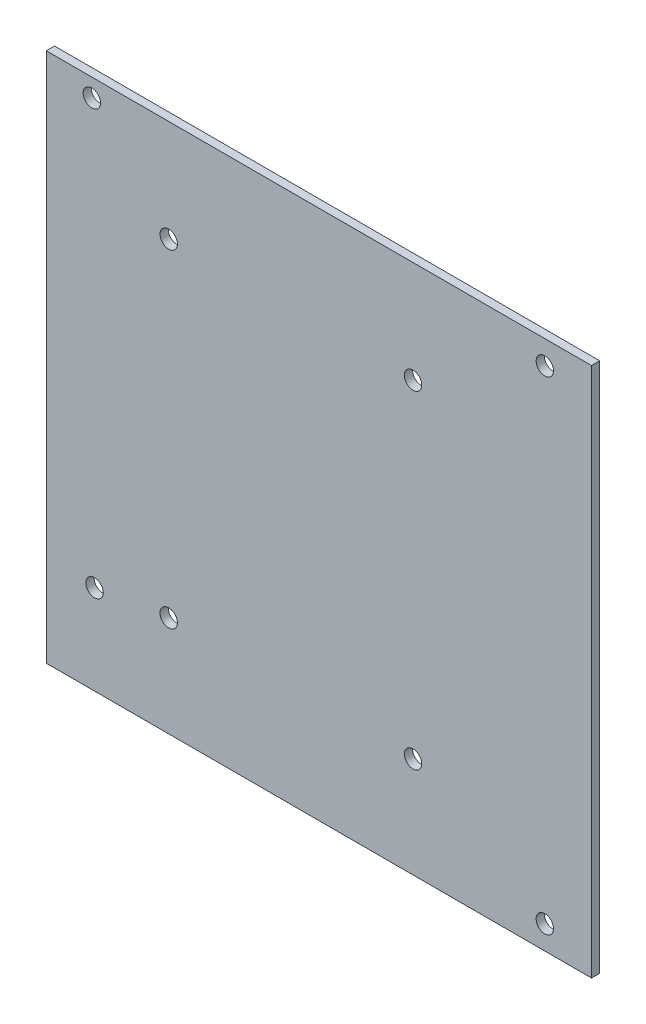
ISO-10303-21;
HEADER;
FILE_DESCRIPTION(('STEP AP214'),'2;1');
FILE_NAME('part.step','',(''),(''),'','','');
FILE_SCHEMA(('AUTOMOTIVE_DESIGN { 1 0 10303 214 1 1 1 1 }'));
ENDSEC;
DATA;
#1=APPLICATION_CONTEXT('core data for automotive mechanical design processes');
#2=APPLICATION_PROTOCOL_DEFINITION('international standard','automotive_design',2000,#1);
#3=PRODUCT_CONTEXT('',#1,'mechanical');
#4=PRODUCT('Part','Part','',(#3));
#5=PRODUCT_RELATED_PRODUCT_CATEGORY('part','',(#4));
#6=PRODUCT_DEFINITION_FORMATION('','',#4);
#7=PRODUCT_DEFINITION_CONTEXT('part definition',#1,'design');
#8=PRODUCT_DEFINITION('design','',#6,#7);
#9=PRODUCT_DEFINITION_SHAPE('','',#8);
#10=(LENGTH_UNIT() NAMED_UNIT(*) SI_UNIT(.MILLI.,.METRE.));
#11=(NAMED_UNIT(*) PLANE_ANGLE_UNIT() SI_UNIT($,.RADIAN.));
#12=(NAMED_UNIT(*) SI_UNIT($,.STERADIAN.) SOLID_ANGLE_UNIT());
#13=UNCERTAINTY_MEASURE_WITH_UNIT(LENGTH_MEASURE(1.E-05),#10,'distance_accuracy_value','');
#14=(GEOMETRIC_REPRESENTATION_CONTEXT(3) GLOBAL_UNCERTAINTY_ASSIGNED_CONTEXT((#13)) GLOBAL_UNIT_ASSIGNED_CONTEXT((#10,
#11,#12)) REPRESENTATION_CONTEXT('',''));
#15=CARTESIAN_POINT('',(0.,0.,0.));
#16=DIRECTION('',(0.,0.,1.));
#17=DIRECTION('',(1.,0.,0.));
#18=AXIS2_PLACEMENT_3D('',#15,#16,#17);
#19=CARTESIAN_POINT('',(0.,0.,1.5));
#20=DIRECTION('',(0.,0.,1.));
#21=DIRECTION('',(1.,0.,0.));
#22=AXIS2_PLACEMENT_3D('',#19,#20,#21);
#23=PLANE('',#22);
#24=CARTESIAN_POINT('',(72.92,78.42,1.5));
#25=DIRECTION('',(0.,0.,1.));
#26=DIRECTION('',(1.,0.,0.));
#27=AXIS2_PLACEMENT_3D('',#24,#25,#26);
#28=CIRCLE('',#27,1.585);
#29=CARTESIAN_POINT('',(74.505,78.42,1.5));
#30=VERTEX_POINT('',#29);
#31=EDGE_CURVE('E149',#30,#30,#28,.T.);
#32=ORIENTED_EDGE('',*,*,#31,.F.);
#33=EDGE_LOOP('',(#32));
#34=FACE_BOUND('',#33,.T.);
#35=CARTESIAN_POINT('',(-9.07999999999999,2.42,1.5));
#36=DIRECTION('',(0.,0.,1.));
#37=DIRECTION('',(1.,0.,0.));
#38=AXIS2_PLACEMENT_3D('',#35,#36,#37);
#39=CIRCLE('',#38,1.585);
#40=CARTESIAN_POINT('',(-7.49499999999999,2.42,1.5));
#41=VERTEX_POINT('',#40);
#42=EDGE_CURVE('E137',#41,#41,#39,.T.);
#43=ORIENTED_EDGE('',*,*,#42,.F.);
#44=EDGE_LOOP('',(#43));
#45=FACE_BOUND('',#44,.T.);
#46=CARTESIAN_POINT('',(4.42000000000001,4.42,1.5));
#47=DIRECTION('',(0.,0.,1.));
#48=DIRECTION('',(1.,0.,0.));
#49=AXIS2_PLACEMENT_3D('',#46,#47,#48);
#50=CIRCLE('',#49,1.585);
#51=CARTESIAN_POINT('',(6.00500000000001,4.42,1.5));
#52=VERTEX_POINT('',#51);
#53=EDGE_CURVE('E125',#52,#52,#50,.T.);
#54=ORIENTED_EDGE('',*,*,#53,.F.);
#55=EDGE_LOOP('',(#54));
#56=FACE_BOUND('',#55,.T.);
#57=CARTESIAN_POINT('',(48.92,64.16,1.5));
#58=DIRECTION('',(0.,0.,1.));
#59=DIRECTION('',(1.,0.,0.));
#60=AXIS2_PLACEMENT_3D('',#57,#58,#59);
#61=CIRCLE('',#60,1.585);
#62=CARTESIAN_POINT('',(50.505,64.16,1.5));
#63=VERTEX_POINT('',#62);
#64=EDGE_CURVE('E104',#63,#63,#61,.T.);
#65=ORIENTED_EDGE('',*,*,#64,.F.);
#66=EDGE_LOOP('',(#65));
#67=FACE_BOUND('',#66,.T.);
#68=DIRECTION('',(0.,-1.,0.));
#69=VECTOR('',#68,1.);
#70=CARTESIAN_POINT('',(-17.88,82.72,1.5));
#71=LINE('',#70,#69);
#72=CARTESIAN_POINT('',(-17.88,82.72,1.5));
#73=VERTEX_POINT('',#72);
#74=CARTESIAN_POINT('',(-17.88,-13.88,1.5));
#75=VERTEX_POINT('',#74);
#76=EDGE_CURVE('E89',#73,#75,#71,.T.);
#77=ORIENTED_EDGE('',*,*,#76,.T.);
#78=DIRECTION('',(1.,0.,0.));
#79=VECTOR('',#78,1.);
#80=CARTESIAN_POINT('',(-17.88,-13.88,1.5));
#81=LINE('',#80,#79);
#82=CARTESIAN_POINT('',(81.42,-13.88,1.5));
#83=VERTEX_POINT('',#82);
#84=EDGE_CURVE('E84',#75,#83,#81,.T.);
#85=ORIENTED_EDGE('',*,*,#84,.T.);
#86=DIRECTION('',(0.,1.,0.));
#87=VECTOR('',#86,1.);
#88=CARTESIAN_POINT('',(81.42,82.72,1.5));
#89=LINE('',#88,#87);
#90=CARTESIAN_POINT('',(81.42,82.72,1.5));
#91=VERTEX_POINT('',#90);
#92=EDGE_CURVE('E87',#83,#91,#89,.T.);
#93=ORIENTED_EDGE('',*,*,#92,.T.);
#94=DIRECTION('',(-1.,0.,0.));
#95=VECTOR('',#94,1.);
#96=CARTESIAN_POINT('',(-17.88,82.72,1.5));
#97=LINE('',#96,#95);
#98=EDGE_CURVE('E54',#91,#73,#97,.T.);
#99=ORIENTED_EDGE('',*,*,#98,.T.);
#100=EDGE_LOOP('',(#77,#85,#93,#99));
#101=FACE_BOUND('',#100,.T.);
#102=CARTESIAN_POINT('',(4.42,64.16,1.5));
#103=DIRECTION('',(0.,0.,1.));
#104=DIRECTION('',(1.,0.,0.));
#105=AXIS2_PLACEMENT_3D('',#102,#103,#104);
#106=CIRCLE('',#105,1.58499999999999);
#107=CARTESIAN_POINT('',(6.00499999999999,64.16,1.5));
#108=VERTEX_POINT('',#107);
#109=EDGE_CURVE('E119',#108,#108,#106,.T.);
#110=ORIENTED_EDGE('',*,*,#109,.F.);
#111=EDGE_LOOP('',(#110));
#112=FACE_BOUND('',#111,.T.);
#113=CARTESIAN_POINT('',(48.92,4.42,1.5));
#114=DIRECTION('',(0.,0.,1.));
#115=DIRECTION('',(1.,0.,0.));
#116=AXIS2_PLACEMENT_3D('',#113,#114,#115);
#117=CIRCLE('',#116,1.585);
#118=CARTESIAN_POINT('',(50.505,4.42,1.5));
#119=VERTEX_POINT('',#118);
#120=EDGE_CURVE('E131',#119,#119,#117,.T.);
#121=ORIENTED_EDGE('',*,*,#120,.F.);
#122=EDGE_LOOP('',(#121));
#123=FACE_BOUND('',#122,.T.);
#124=CARTESIAN_POINT('',(72.92,-9.58,1.5));
#125=DIRECTION('',(0.,0.,1.));
#126=DIRECTION('',(1.,0.,0.));
#127=AXIS2_PLACEMENT_3D('',#124,#125,#126);
#128=CIRCLE('',#127,1.585);
#129=CARTESIAN_POINT('',(74.505,-9.58,1.5));
#130=VERTEX_POINT('',#129);
#131=EDGE_CURVE('E143',#130,#130,#128,.T.);
#132=ORIENTED_EDGE('',*,*,#131,.F.);
#133=EDGE_LOOP('',(#132));
#134=FACE_BOUND('',#133,.T.);
#135=CARTESIAN_POINT('',(-9.58,79.42,1.5));
#136=DIRECTION('',(0.,0.,1.));
#137=DIRECTION('',(1.,0.,0.));
#138=AXIS2_PLACEMENT_3D('',#135,#136,#137);
#139=CIRCLE('',#138,1.585);
#140=CARTESIAN_POINT('',(-7.995,79.42,1.5));
#141=VERTEX_POINT('',#140);
#142=EDGE_CURVE('E155',#141,#141,#139,.T.);
#143=ORIENTED_EDGE('',*,*,#142,.F.);
#144=EDGE_LOOP('',(#143));
#145=FACE_BOUND('',#144,.T.);
#146=ADVANCED_FACE('F37',(#34,#45,#56,#67,#101,#112,#123,#134,#145),#23,.T.);
#147=CARTESIAN_POINT('',(0.,0.,0.));
#148=DIRECTION('',(0.,0.,1.));
#149=DIRECTION('',(1.,0.,0.));
#150=AXIS2_PLACEMENT_3D('',#147,#148,#149);
#151=PLANE('',#150);
#152=DIRECTION('',(0.,-1.,0.));
#153=VECTOR('',#152,1.);
#154=CARTESIAN_POINT('',(-17.88,82.72,0.));
#155=LINE('',#154,#153);
#156=CARTESIAN_POINT('',(-17.88,82.72,0.));
#157=VERTEX_POINT('',#156);
#158=CARTESIAN_POINT('',(-17.88,-13.88,0.));
#159=VERTEX_POINT('',#158);
#160=EDGE_CURVE('E101',#157,#159,#155,.T.);
#161=ORIENTED_EDGE('',*,*,#160,.F.);
#162=DIRECTION('',(-1.,0.,0.));
#163=VECTOR('',#162,1.);
#164=CARTESIAN_POINT('',(-17.88,82.72,0.));
#165=LINE('',#164,#163);
#166=CARTESIAN_POINT('',(81.42,82.72,0.));
#167=VERTEX_POINT('',#166);
#168=EDGE_CURVE('E77',#167,#157,#165,.T.);
#169=ORIENTED_EDGE('',*,*,#168,.F.);
#170=DIRECTION('',(0.,1.,0.));
#171=VECTOR('',#170,1.);
#172=CARTESIAN_POINT('',(81.42,82.72,0.));
#173=LINE('',#172,#171);
#174=CARTESIAN_POINT('',(81.42,-13.88,0.));
#175=VERTEX_POINT('',#174);
#176=EDGE_CURVE('E71',#175,#167,#173,.T.);
#177=ORIENTED_EDGE('',*,*,#176,.F.);
#178=DIRECTION('',(1.,0.,0.));
#179=VECTOR('',#178,1.);
#180=CARTESIAN_POINT('',(-17.88,-13.88,0.));
#181=LINE('',#180,#179);
#182=EDGE_CURVE('E93',#159,#175,#181,.T.);
#183=ORIENTED_EDGE('',*,*,#182,.F.);
#184=EDGE_LOOP('',(#161,#169,#177,#183));
#185=FACE_BOUND('',#184,.T.);
#186=CARTESIAN_POINT('',(48.92,64.16,0.));
#187=DIRECTION('',(0.,0.,1.));
#188=DIRECTION('',(1.,0.,0.));
#189=AXIS2_PLACEMENT_3D('',#186,#187,#188);
#190=CIRCLE('',#189,1.585);
#191=CARTESIAN_POINT('',(50.505,64.16,0.));
#192=VERTEX_POINT('',#191);
#193=EDGE_CURVE('E116',#192,#192,#190,.T.);
#194=ORIENTED_EDGE('',*,*,#193,.T.);
#195=EDGE_LOOP('',(#194));
#196=FACE_BOUND('',#195,.T.);
#197=CARTESIAN_POINT('',(4.42,64.16,0.));
#198=DIRECTION('',(0.,0.,1.));
#199=DIRECTION('',(1.,0.,0.));
#200=AXIS2_PLACEMENT_3D('',#197,#198,#199);
#201=CIRCLE('',#200,1.58499999999999);
#202=CARTESIAN_POINT('',(6.00499999999999,64.16,0.));
#203=VERTEX_POINT('',#202);
#204=EDGE_CURVE('E122',#203,#203,#201,.T.);
#205=ORIENTED_EDGE('',*,*,#204,.T.);
#206=EDGE_LOOP('',(#205));
#207=FACE_BOUND('',#206,.T.);
#208=CARTESIAN_POINT('',(4.42000000000001,4.42,0.));
#209=DIRECTION('',(0.,0.,1.));
#210=DIRECTION('',(1.,0.,0.));
#211=AXIS2_PLACEMENT_3D('',#208,#209,#210);
#212=CIRCLE('',#211,1.585);
#213=CARTESIAN_POINT('',(6.00500000000001,4.42,0.));
#214=VERTEX_POINT('',#213);
#215=EDGE_CURVE('E128',#214,#214,#212,.T.);
#216=ORIENTED_EDGE('',*,*,#215,.T.);
#217=EDGE_LOOP('',(#216));
#218=FACE_BOUND('',#217,.T.);
#219=CARTESIAN_POINT('',(48.92,4.42,0.));
#220=DIRECTION('',(0.,0.,1.));
#221=DIRECTION('',(1.,0.,0.));
#222=AXIS2_PLACEMENT_3D('',#219,#220,#221);
#223=CIRCLE('',#222,1.585);
#224=CARTESIAN_POINT('',(50.505,4.42,0.));
#225=VERTEX_POINT('',#224);
#226=EDGE_CURVE('E134',#225,#225,#223,.T.);
#227=ORIENTED_EDGE('',*,*,#226,.T.);
#228=EDGE_LOOP('',(#227));
#229=FACE_BOUND('',#228,.T.);
#230=CARTESIAN_POINT('',(-9.07999999999999,2.42,0.));
#231=DIRECTION('',(0.,0.,1.));
#232=DIRECTION('',(1.,0.,0.));
#233=AXIS2_PLACEMENT_3D('',#230,#231,#232);
#234=CIRCLE('',#233,1.585);
#235=CARTESIAN_POINT('',(-7.49499999999999,2.42,0.));
#236=VERTEX_POINT('',#235);
#237=EDGE_CURVE('E140',#236,#236,#234,.T.);
#238=ORIENTED_EDGE('',*,*,#237,.T.);
#239=EDGE_LOOP('',(#238));
#240=FACE_BOUND('',#239,.T.);
#241=CARTESIAN_POINT('',(72.92,-9.58,0.));
#242=DIRECTION('',(0.,0.,1.));
#243=DIRECTION('',(1.,0.,0.));
#244=AXIS2_PLACEMENT_3D('',#241,#242,#243);
#245=CIRCLE('',#244,1.585);
#246=CARTESIAN_POINT('',(74.505,-9.58,0.));
#247=VERTEX_POINT('',#246);
#248=EDGE_CURVE('E146',#247,#247,#245,.T.);
#249=ORIENTED_EDGE('',*,*,#248,.T.);
#250=EDGE_LOOP('',(#249));
#251=FACE_BOUND('',#250,.T.);
#252=CARTESIAN_POINT('',(72.92,78.42,0.));
#253=DIRECTION('',(0.,0.,1.));
#254=DIRECTION('',(1.,0.,0.));
#255=AXIS2_PLACEMENT_3D('',#252,#253,#254);
#256=CIRCLE('',#255,1.585);
#257=CARTESIAN_POINT('',(74.505,78.42,0.));
#258=VERTEX_POINT('',#257);
#259=EDGE_CURVE('E152',#258,#258,#256,.T.);
#260=ORIENTED_EDGE('',*,*,#259,.T.);
#261=EDGE_LOOP('',(#260));
#262=FACE_BOUND('',#261,.T.);
#263=CARTESIAN_POINT('',(-9.58,79.42,0.));
#264=DIRECTION('',(0.,0.,1.));
#265=DIRECTION('',(1.,0.,0.));
#266=AXIS2_PLACEMENT_3D('',#263,#264,#265);
#267=CIRCLE('',#266,1.585);
#268=CARTESIAN_POINT('',(-7.995,79.42,0.));
#269=VERTEX_POINT('',#268);
#270=EDGE_CURVE('E158',#269,#269,#267,.T.);
#271=ORIENTED_EDGE('',*,*,#270,.T.);
#272=EDGE_LOOP('',(#271));
#273=FACE_BOUND('',#272,.T.);
#274=ADVANCED_FACE('F112',(#185,#196,#207,#218,#229,#240,#251,#262,#273),#151,.F.);
#275=CARTESIAN_POINT('',(-17.88,82.72,1.5));
#276=DIRECTION('',(1.,0.,0.));
#277=DIRECTION('',(0.,1.,0.));
#278=AXIS2_PLACEMENT_3D('',#275,#276,#277);
#279=PLANE('',#278);
#280=ORIENTED_EDGE('',*,*,#160,.T.);
#281=DIRECTION('',(0.,0.,-1.));
#282=VECTOR('',#281,1.);
#283=CARTESIAN_POINT('',(-17.88,-13.88,1.5));
#284=LINE('',#283,#282);
#285=EDGE_CURVE('E11',#75,#159,#284,.T.);
#286=ORIENTED_EDGE('',*,*,#285,.F.);
#287=ORIENTED_EDGE('',*,*,#76,.F.);
#288=DIRECTION('',(0.,0.,-1.));
#289=VECTOR('',#288,1.);
#290=CARTESIAN_POINT('',(-17.88,82.72,1.5));
#291=LINE('',#290,#289);
#292=EDGE_CURVE('E97',#73,#157,#291,.T.);
#293=ORIENTED_EDGE('',*,*,#292,.T.);
#294=EDGE_LOOP('',(#280,#286,#287,#293));
#295=FACE_BOUND('',#294,.T.);
#296=ADVANCED_FACE('F39',(#295),#279,.F.);
#297=CARTESIAN_POINT('',(-17.88,-13.88,1.5));
#298=DIRECTION('',(0.,1.,0.));
#299=DIRECTION('',(-1.,0.,0.));
#300=AXIS2_PLACEMENT_3D('',#297,#298,#299);
#301=PLANE('',#300);
#302=ORIENTED_EDGE('',*,*,#182,.T.);
#303=DIRECTION('',(0.,0.,-1.));
#304=VECTOR('',#303,1.);
#305=CARTESIAN_POINT('',(81.42,-13.88,1.5));
#306=LINE('',#305,#304);
#307=EDGE_CURVE('E46',#83,#175,#306,.T.);
#308=ORIENTED_EDGE('',*,*,#307,.F.);
#309=ORIENTED_EDGE('',*,*,#84,.F.);
#310=ORIENTED_EDGE('',*,*,#285,.T.);
#311=EDGE_LOOP('',(#302,#308,#309,#310));
#312=FACE_BOUND('',#311,.T.);
#313=ADVANCED_FACE('F92',(#312),#301,.F.);
#314=CARTESIAN_POINT('',(81.42,82.72,1.5));
#315=DIRECTION('',(-1.,0.,0.));
#316=DIRECTION('',(0.,-1.,0.));
#317=AXIS2_PLACEMENT_3D('',#314,#315,#316);
#318=PLANE('',#317);
#319=ORIENTED_EDGE('',*,*,#176,.T.);
#320=DIRECTION('',(0.,0.,-1.));
#321=VECTOR('',#320,1.);
#322=CARTESIAN_POINT('',(81.42,82.72,1.5));
#323=LINE('',#322,#321);
#324=EDGE_CURVE('E94',#91,#167,#323,.T.);
#325=ORIENTED_EDGE('',*,*,#324,.F.);
#326=ORIENTED_EDGE('',*,*,#92,.F.);
#327=ORIENTED_EDGE('',*,*,#307,.T.);
#328=EDGE_LOOP('',(#319,#325,#326,#327));
#329=FACE_BOUND('',#328,.T.);
#330=ADVANCED_FACE('F95',(#329),#318,.F.);
#331=CARTESIAN_POINT('',(-17.88,82.72,1.5));
#332=DIRECTION('',(0.,-1.,0.));
#333=DIRECTION('',(0.,0.,-1.));
#334=AXIS2_PLACEMENT_3D('',#331,#332,#333);
#335=PLANE('',#334);
#336=ORIENTED_EDGE('',*,*,#168,.T.);
#337=ORIENTED_EDGE('',*,*,#292,.F.);
#338=ORIENTED_EDGE('',*,*,#98,.F.);
#339=ORIENTED_EDGE('',*,*,#324,.T.);
#340=EDGE_LOOP('',(#336,#337,#338,#339));
#341=FACE_BOUND('',#340,.T.);
#342=ADVANCED_FACE('F109',(#341),#335,.F.);
#343=CARTESIAN_POINT('',(48.92,64.16,1.5));
#344=DIRECTION('',(0.,0.,-1.));
#345=DIRECTION('',(-1.,0.,0.));
#346=AXIS2_PLACEMENT_3D('',#343,#344,#345);
#347=CYLINDRICAL_SURFACE('',#346,1.585);
#348=ORIENTED_EDGE('',*,*,#64,.T.);
#349=EDGE_LOOP('',(#348));
#350=FACE_BOUND('',#349,.T.);
#351=ORIENTED_EDGE('',*,*,#193,.F.);
#352=EDGE_LOOP('',(#351));
#353=FACE_BOUND('',#352,.T.);
#354=ADVANCED_FACE('F177',(#350,#353),#347,.F.);
#355=CARTESIAN_POINT('',(4.42,64.16,1.5));
#356=DIRECTION('',(0.,0.,-1.));
#357=DIRECTION('',(-1.,0.,0.));
#358=AXIS2_PLACEMENT_3D('',#355,#356,#357);
#359=CYLINDRICAL_SURFACE('',#358,1.58499999999999);
#360=ORIENTED_EDGE('',*,*,#109,.T.);
#361=EDGE_LOOP('',(#360));
#362=FACE_BOUND('',#361,.T.);
#363=ORIENTED_EDGE('',*,*,#204,.F.);
#364=EDGE_LOOP('',(#363));
#365=FACE_BOUND('',#364,.T.);
#366=ADVANCED_FACE('F223',(#362,#365),#359,.F.);
#367=CARTESIAN_POINT('',(4.42000000000001,4.42,1.5));
#368=DIRECTION('',(0.,0.,-1.));
#369=DIRECTION('',(-1.,0.,0.));
#370=AXIS2_PLACEMENT_3D('',#367,#368,#369);
#371=CYLINDRICAL_SURFACE('',#370,1.585);
#372=ORIENTED_EDGE('',*,*,#53,.T.);
#373=EDGE_LOOP('',(#372));
#374=FACE_BOUND('',#373,.T.);
#375=ORIENTED_EDGE('',*,*,#215,.F.);
#376=EDGE_LOOP('',(#375));
#377=FACE_BOUND('',#376,.T.);
#378=ADVANCED_FACE('F231',(#374,#377),#371,.F.);
#379=CARTESIAN_POINT('',(48.92,4.42,1.5));
#380=DIRECTION('',(0.,0.,-1.));
#381=DIRECTION('',(-1.,0.,0.));
#382=AXIS2_PLACEMENT_3D('',#379,#380,#381);
#383=CYLINDRICAL_SURFACE('',#382,1.585);
#384=ORIENTED_EDGE('',*,*,#120,.T.);
#385=EDGE_LOOP('',(#384));
#386=FACE_BOUND('',#385,.T.);
#387=ORIENTED_EDGE('',*,*,#226,.F.);
#388=EDGE_LOOP('',(#387));
#389=FACE_BOUND('',#388,.T.);
#390=ADVANCED_FACE('F239',(#386,#389),#383,.F.);
#391=CARTESIAN_POINT('',(-9.07999999999999,2.42,1.5));
#392=DIRECTION('',(0.,0.,-1.));
#393=DIRECTION('',(-1.,0.,0.));
#394=AXIS2_PLACEMENT_3D('',#391,#392,#393);
#395=CYLINDRICAL_SURFACE('',#394,1.585);
#396=ORIENTED_EDGE('',*,*,#42,.T.);
#397=EDGE_LOOP('',(#396));
#398=FACE_BOUND('',#397,.T.);
#399=ORIENTED_EDGE('',*,*,#237,.F.);
#400=EDGE_LOOP('',(#399));
#401=FACE_BOUND('',#400,.T.);
#402=ADVANCED_FACE('F248',(#398,#401),#395,.F.);
#403=CARTESIAN_POINT('',(72.92,-9.58,1.5));
#404=DIRECTION('',(0.,0.,-1.));
#405=DIRECTION('',(-1.,0.,0.));
#406=AXIS2_PLACEMENT_3D('',#403,#404,#405);
#407=CYLINDRICAL_SURFACE('',#406,1.585);
#408=ORIENTED_EDGE('',*,*,#131,.T.);
#409=EDGE_LOOP('',(#408));
#410=FACE_BOUND('',#409,.T.);
#411=ORIENTED_EDGE('',*,*,#248,.F.);
#412=EDGE_LOOP('',(#411));
#413=FACE_BOUND('',#412,.T.);
#414=ADVANCED_FACE('F257',(#410,#413),#407,.F.);
#415=CARTESIAN_POINT('',(72.92,78.42,1.5));
#416=DIRECTION('',(0.,0.,-1.));
#417=DIRECTION('',(-1.,0.,0.));
#418=AXIS2_PLACEMENT_3D('',#415,#416,#417);
#419=CYLINDRICAL_SURFACE('',#418,1.585);
#420=ORIENTED_EDGE('',*,*,#31,.T.);
#421=EDGE_LOOP('',(#420));
#422=FACE_BOUND('',#421,.T.);
#423=ORIENTED_EDGE('',*,*,#259,.F.);
#424=EDGE_LOOP('',(#423));
#425=FACE_BOUND('',#424,.T.);
#426=ADVANCED_FACE('F266',(#422,#425),#419,.F.);
#427=CARTESIAN_POINT('',(-9.58,79.42,1.5));
#428=DIRECTION('',(0.,0.,-1.));
#429=DIRECTION('',(-1.,0.,0.));
#430=AXIS2_PLACEMENT_3D('',#427,#428,#429);
#431=CYLINDRICAL_SURFACE('',#430,1.585);
#432=ORIENTED_EDGE('',*,*,#142,.T.);
#433=EDGE_LOOP('',(#432));
#434=FACE_BOUND('',#433,.T.);
#435=ORIENTED_EDGE('',*,*,#270,.F.);
#436=EDGE_LOOP('',(#435));
#437=FACE_BOUND('',#436,.T.);
#438=ADVANCED_FACE('F164',(#434,#437),#431,.F.);
#439=CLOSED_SHELL('',(#146,#274,#296,#313,#330,#342,#354,#366,#378,#390,#402,#414,#426,#438));
#440=MANIFOLD_SOLID_BREP('B2',#439);
#441=ADVANCED_BREP_SHAPE_REPRESENTATION('',(#18,#440),#14);
#442=SHAPE_DEFINITION_REPRESENTATION(#9,#441);
ENDSEC;
END-ISO-10303-21;
